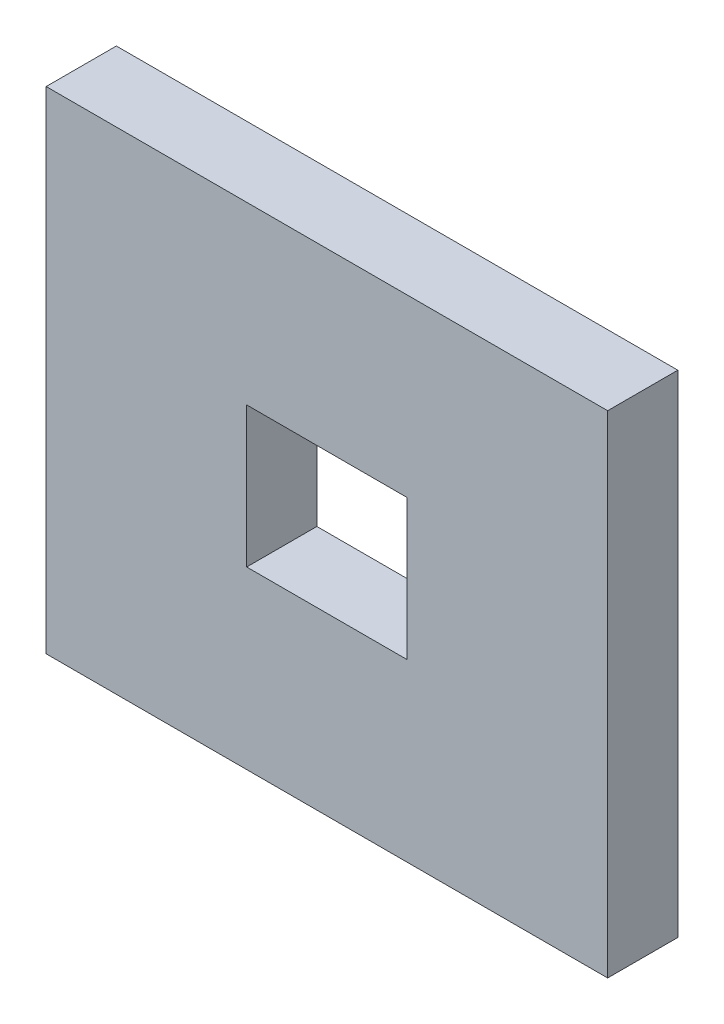
ISO-10303-21;
HEADER;
FILE_DESCRIPTION(('STEP AP214'),'2;1');
FILE_NAME('part.step','',(''),(''),'','','');
FILE_SCHEMA(('AUTOMOTIVE_DESIGN { 1 0 10303 214 1 1 1 1 }'));
ENDSEC;
DATA;
#1=APPLICATION_CONTEXT('core data for automotive mechanical design processes');
#2=APPLICATION_PROTOCOL_DEFINITION('international standard','automotive_design',2000,#1);
#3=PRODUCT_CONTEXT('',#1,'mechanical');
#4=PRODUCT('Part','Part','',(#3));
#5=PRODUCT_RELATED_PRODUCT_CATEGORY('part','',(#4));
#6=PRODUCT_DEFINITION_FORMATION('','',#4);
#7=PRODUCT_DEFINITION_CONTEXT('part definition',#1,'design');
#8=PRODUCT_DEFINITION('design','',#6,#7);
#9=PRODUCT_DEFINITION_SHAPE('','',#8);
#10=(LENGTH_UNIT() NAMED_UNIT(*) SI_UNIT(.MILLI.,.METRE.));
#11=(NAMED_UNIT(*) PLANE_ANGLE_UNIT() SI_UNIT($,.RADIAN.));
#12=(NAMED_UNIT(*) SI_UNIT($,.STERADIAN.) SOLID_ANGLE_UNIT());
#13=UNCERTAINTY_MEASURE_WITH_UNIT(LENGTH_MEASURE(1.E-05),#10,'distance_accuracy_value','');
#14=(GEOMETRIC_REPRESENTATION_CONTEXT(3) GLOBAL_UNCERTAINTY_ASSIGNED_CONTEXT((#13)) GLOBAL_UNIT_ASSIGNED_CONTEXT((#10,
#11,#12)) REPRESENTATION_CONTEXT('',''));
#15=CARTESIAN_POINT('',(0.,0.,0.));
#16=DIRECTION('',(0.,0.,1.));
#17=DIRECTION('',(1.,0.,0.));
#18=AXIS2_PLACEMENT_3D('',#15,#16,#17);
#19=CARTESIAN_POINT('',(0.,0.,10.));
#20=DIRECTION('',(0.,0.,-1.));
#21=DIRECTION('',(-1.,0.,0.));
#22=AXIS2_PLACEMENT_3D('',#19,#20,#21);
#23=PLANE('',#22);
#24=DIRECTION('',(0.,-1.,0.));
#25=VECTOR('',#24,1.);
#26=CARTESIAN_POINT('',(-40.,35.,10.));
#27=LINE('',#26,#25);
#28=CARTESIAN_POINT('',(-40.,35.,10.));
#29=VERTEX_POINT('',#28);
#30=CARTESIAN_POINT('',(-40.,-35.,10.));
#31=VERTEX_POINT('',#30);
#32=EDGE_CURVE('E135',#29,#31,#27,.T.);
#33=ORIENTED_EDGE('',*,*,#32,.T.);
#34=DIRECTION('',(1.,0.,0.));
#35=VECTOR('',#34,1.);
#36=CARTESIAN_POINT('',(40.,-35.,10.));
#37=LINE('',#36,#35);
#38=CARTESIAN_POINT('',(40.,-35.,10.));
#39=VERTEX_POINT('',#38);
#40=EDGE_CURVE('E138',#31,#39,#37,.T.);
#41=ORIENTED_EDGE('',*,*,#40,.T.);
#42=DIRECTION('',(0.,1.,0.));
#43=VECTOR('',#42,1.);
#44=CARTESIAN_POINT('',(40.,35.,10.));
#45=LINE('',#44,#43);
#46=CARTESIAN_POINT('',(40.,35.,10.));
#47=VERTEX_POINT('',#46);
#48=EDGE_CURVE('E141',#39,#47,#45,.T.);
#49=ORIENTED_EDGE('',*,*,#48,.T.);
#50=DIRECTION('',(-1.,0.,0.));
#51=VECTOR('',#50,1.);
#52=CARTESIAN_POINT('',(40.,35.,10.));
#53=LINE('',#52,#51);
#54=EDGE_CURVE('E143',#47,#29,#53,.T.);
#55=ORIENTED_EDGE('',*,*,#54,.T.);
#56=EDGE_LOOP('',(#33,#41,#49,#55));
#57=FACE_BOUND('',#56,.T.);
#58=DIRECTION('',(0.,-1.,0.));
#59=VECTOR('',#58,1.);
#60=CARTESIAN_POINT('',(-11.4285714285714,10.,10.));
#61=LINE('',#60,#59);
#62=CARTESIAN_POINT('',(-11.4285714285714,10.,10.));
#63=VERTEX_POINT('',#62);
#64=CARTESIAN_POINT('',(-11.4285714285714,-10.,10.));
#65=VERTEX_POINT('',#64);
#66=EDGE_CURVE('E99',#63,#65,#61,.T.);
#67=ORIENTED_EDGE('',*,*,#66,.F.);
#68=DIRECTION('',(-1.,0.,0.));
#69=VECTOR('',#68,1.);
#70=CARTESIAN_POINT('',(11.4285714285714,10.,10.));
#71=LINE('',#70,#69);
#72=CARTESIAN_POINT('',(11.4285714285714,10.,10.));
#73=VERTEX_POINT('',#72);
#74=EDGE_CURVE('E121',#73,#63,#71,.T.);
#75=ORIENTED_EDGE('',*,*,#74,.F.);
#76=DIRECTION('',(0.,1.,0.));
#77=VECTOR('',#76,1.);
#78=CARTESIAN_POINT('',(11.4285714285714,10.,10.));
#79=LINE('',#78,#77);
#80=CARTESIAN_POINT('',(11.4285714285714,-10.,10.));
#81=VERTEX_POINT('',#80);
#82=EDGE_CURVE('E119',#81,#73,#79,.T.);
#83=ORIENTED_EDGE('',*,*,#82,.F.);
#84=DIRECTION('',(1.,0.,0.));
#85=VECTOR('',#84,1.);
#86=CARTESIAN_POINT('',(11.4285714285714,-10.,10.));
#87=LINE('',#86,#85);
#88=EDGE_CURVE('E107',#65,#81,#87,.T.);
#89=ORIENTED_EDGE('',*,*,#88,.F.);
#90=EDGE_LOOP('',(#67,#75,#83,#89));
#91=FACE_BOUND('',#90,.T.);
#92=ADVANCED_FACE('F34',(#57,#91),#23,.F.);
#93=CARTESIAN_POINT('',(0.,0.,0.));
#94=DIRECTION('',(0.,0.,-1.));
#95=DIRECTION('',(-1.,0.,0.));
#96=AXIS2_PLACEMENT_3D('',#93,#94,#95);
#97=PLANE('',#96);
#98=DIRECTION('',(0.,-1.,0.));
#99=VECTOR('',#98,1.);
#100=CARTESIAN_POINT('',(-40.,35.,0.));
#101=LINE('',#100,#99);
#102=CARTESIAN_POINT('',(-40.,35.,0.));
#103=VERTEX_POINT('',#102);
#104=CARTESIAN_POINT('',(-40.,-35.,0.));
#105=VERTEX_POINT('',#104);
#106=EDGE_CURVE('E115',#103,#105,#101,.T.);
#107=ORIENTED_EDGE('',*,*,#106,.F.);
#108=DIRECTION('',(-1.,0.,0.));
#109=VECTOR('',#108,1.);
#110=CARTESIAN_POINT('',(40.,35.,0.));
#111=LINE('',#110,#109);
#112=CARTESIAN_POINT('',(40.,35.,0.));
#113=VERTEX_POINT('',#112);
#114=EDGE_CURVE('E139',#113,#103,#111,.T.);
#115=ORIENTED_EDGE('',*,*,#114,.F.);
#116=DIRECTION('',(0.,1.,0.));
#117=VECTOR('',#116,1.);
#118=CARTESIAN_POINT('',(40.,35.,0.));
#119=LINE('',#118,#117);
#120=CARTESIAN_POINT('',(40.,-35.,0.));
#121=VERTEX_POINT('',#120);
#122=EDGE_CURVE('E150',#121,#113,#119,.T.);
#123=ORIENTED_EDGE('',*,*,#122,.F.);
#124=DIRECTION('',(1.,0.,0.));
#125=VECTOR('',#124,1.);
#126=CARTESIAN_POINT('',(40.,-35.,0.));
#127=LINE('',#126,#125);
#128=EDGE_CURVE('E148',#105,#121,#127,.T.);
#129=ORIENTED_EDGE('',*,*,#128,.F.);
#130=EDGE_LOOP('',(#107,#115,#123,#129));
#131=FACE_BOUND('',#130,.T.);
#132=DIRECTION('',(-1.,0.,0.));
#133=VECTOR('',#132,1.);
#134=CARTESIAN_POINT('',(11.4285714285714,10.,0.));
#135=LINE('',#134,#133);
#136=CARTESIAN_POINT('',(11.4285714285714,10.,0.));
#137=VERTEX_POINT('',#136);
#138=CARTESIAN_POINT('',(-11.4285714285714,10.,0.));
#139=VERTEX_POINT('',#138);
#140=EDGE_CURVE('E108',#137,#139,#135,.T.);
#141=ORIENTED_EDGE('',*,*,#140,.T.);
#142=DIRECTION('',(0.,-1.,0.));
#143=VECTOR('',#142,1.);
#144=CARTESIAN_POINT('',(-11.4285714285714,10.,0.));
#145=LINE('',#144,#143);
#146=CARTESIAN_POINT('',(-11.4285714285714,-10.,0.));
#147=VERTEX_POINT('',#146);
#148=EDGE_CURVE('E57',#139,#147,#145,.T.);
#149=ORIENTED_EDGE('',*,*,#148,.T.);
#150=DIRECTION('',(1.,0.,0.));
#151=VECTOR('',#150,1.);
#152=CARTESIAN_POINT('',(11.4285714285714,-10.,0.));
#153=LINE('',#152,#151);
#154=CARTESIAN_POINT('',(11.4285714285714,-10.,0.));
#155=VERTEX_POINT('',#154);
#156=EDGE_CURVE('E114',#147,#155,#153,.T.);
#157=ORIENTED_EDGE('',*,*,#156,.T.);
#158=DIRECTION('',(0.,1.,0.));
#159=VECTOR('',#158,1.);
#160=CARTESIAN_POINT('',(11.4285714285714,10.,0.));
#161=LINE('',#160,#159);
#162=EDGE_CURVE('E127',#155,#137,#161,.T.);
#163=ORIENTED_EDGE('',*,*,#162,.T.);
#164=EDGE_LOOP('',(#141,#149,#157,#163));
#165=FACE_BOUND('',#164,.T.);
#166=ADVANCED_FACE('F168',(#131,#165),#97,.T.);
#167=CARTESIAN_POINT('',(-40.,35.,10.));
#168=DIRECTION('',(1.,0.,0.));
#169=DIRECTION('',(0.,1.,0.));
#170=AXIS2_PLACEMENT_3D('',#167,#168,#169);
#171=PLANE('',#170);
#172=ORIENTED_EDGE('',*,*,#106,.T.);
#173=DIRECTION('',(0.,0.,-1.));
#174=VECTOR('',#173,1.);
#175=CARTESIAN_POINT('',(-40.,-35.,10.));
#176=LINE('',#175,#174);
#177=EDGE_CURVE('E11',#31,#105,#176,.T.);
#178=ORIENTED_EDGE('',*,*,#177,.F.);
#179=ORIENTED_EDGE('',*,*,#32,.F.);
#180=DIRECTION('',(0.,0.,-1.));
#181=VECTOR('',#180,1.);
#182=CARTESIAN_POINT('',(-40.,35.,10.));
#183=LINE('',#182,#181);
#184=EDGE_CURVE('E145',#29,#103,#183,.T.);
#185=ORIENTED_EDGE('',*,*,#184,.T.);
#186=EDGE_LOOP('',(#172,#178,#179,#185));
#187=FACE_BOUND('',#186,.T.);
#188=ADVANCED_FACE('F36',(#187),#171,.F.);
#189=CARTESIAN_POINT('',(40.,-35.,10.));
#190=DIRECTION('',(0.,1.,0.));
#191=DIRECTION('',(-1.,0.,0.));
#192=AXIS2_PLACEMENT_3D('',#189,#190,#191);
#193=PLANE('',#192);
#194=ORIENTED_EDGE('',*,*,#128,.T.);
#195=DIRECTION('',(0.,0.,-1.));
#196=VECTOR('',#195,1.);
#197=CARTESIAN_POINT('',(40.,-35.,10.));
#198=LINE('',#197,#196);
#199=EDGE_CURVE('E42',#39,#121,#198,.T.);
#200=ORIENTED_EDGE('',*,*,#199,.F.);
#201=ORIENTED_EDGE('',*,*,#40,.F.);
#202=ORIENTED_EDGE('',*,*,#177,.T.);
#203=EDGE_LOOP('',(#194,#200,#201,#202));
#204=FACE_BOUND('',#203,.T.);
#205=ADVANCED_FACE('F178',(#204),#193,.F.);
#206=CARTESIAN_POINT('',(40.,35.,10.));
#207=DIRECTION('',(-1.,0.,0.));
#208=DIRECTION('',(0.,-1.,0.));
#209=AXIS2_PLACEMENT_3D('',#206,#207,#208);
#210=PLANE('',#209);
#211=ORIENTED_EDGE('',*,*,#122,.T.);
#212=DIRECTION('',(0.,0.,-1.));
#213=VECTOR('',#212,1.);
#214=CARTESIAN_POINT('',(40.,35.,10.));
#215=LINE('',#214,#213);
#216=EDGE_CURVE('E155',#47,#113,#215,.T.);
#217=ORIENTED_EDGE('',*,*,#216,.F.);
#218=ORIENTED_EDGE('',*,*,#48,.F.);
#219=ORIENTED_EDGE('',*,*,#199,.T.);
#220=EDGE_LOOP('',(#211,#217,#218,#219));
#221=FACE_BOUND('',#220,.T.);
#222=ADVANCED_FACE('F162',(#221),#210,.F.);
#223=CARTESIAN_POINT('',(40.,35.,10.));
#224=DIRECTION('',(0.,-1.,0.));
#225=DIRECTION('',(1.,0.,0.));
#226=AXIS2_PLACEMENT_3D('',#223,#224,#225);
#227=PLANE('',#226);
#228=ORIENTED_EDGE('',*,*,#114,.T.);
#229=ORIENTED_EDGE('',*,*,#184,.F.);
#230=ORIENTED_EDGE('',*,*,#54,.F.);
#231=ORIENTED_EDGE('',*,*,#216,.T.);
#232=EDGE_LOOP('',(#228,#229,#230,#231));
#233=FACE_BOUND('',#232,.T.);
#234=ADVANCED_FACE('F172',(#233),#227,.F.);
#235=CARTESIAN_POINT('',(-11.4285714285714,10.,10.));
#236=DIRECTION('',(1.,0.,0.));
#237=DIRECTION('',(0.,0.,-1.));
#238=AXIS2_PLACEMENT_3D('',#235,#236,#237);
#239=PLANE('',#238);
#240=ORIENTED_EDGE('',*,*,#148,.F.);
#241=DIRECTION('',(0.,0.,-1.));
#242=VECTOR('',#241,1.);
#243=CARTESIAN_POINT('',(-11.4285714285714,10.,10.));
#244=LINE('',#243,#242);
#245=EDGE_CURVE('E103',#63,#139,#244,.T.);
#246=ORIENTED_EDGE('',*,*,#245,.F.);
#247=ORIENTED_EDGE('',*,*,#66,.T.);
#248=DIRECTION('',(0.,0.,-1.));
#249=VECTOR('',#248,1.);
#250=CARTESIAN_POINT('',(-11.4285714285714,-10.,10.));
#251=LINE('',#250,#249);
#252=EDGE_CURVE('E102',#65,#147,#251,.T.);
#253=ORIENTED_EDGE('',*,*,#252,.T.);
#254=EDGE_LOOP('',(#240,#246,#247,#253));
#255=FACE_BOUND('',#254,.T.);
#256=ADVANCED_FACE('F101',(#255),#239,.T.);
#257=CARTESIAN_POINT('',(11.4285714285714,-10.,10.));
#258=DIRECTION('',(0.,1.,0.));
#259=DIRECTION('',(0.,0.,1.));
#260=AXIS2_PLACEMENT_3D('',#257,#258,#259);
#261=PLANE('',#260);
#262=ORIENTED_EDGE('',*,*,#156,.F.);
#263=ORIENTED_EDGE('',*,*,#252,.F.);
#264=ORIENTED_EDGE('',*,*,#88,.T.);
#265=DIRECTION('',(0.,0.,-1.));
#266=VECTOR('',#265,1.);
#267=CARTESIAN_POINT('',(11.4285714285714,-10.,10.));
#268=LINE('',#267,#266);
#269=EDGE_CURVE('E116',#81,#155,#268,.T.);
#270=ORIENTED_EDGE('',*,*,#269,.T.);
#271=EDGE_LOOP('',(#262,#263,#264,#270));
#272=FACE_BOUND('',#271,.T.);
#273=ADVANCED_FACE('F111',(#272),#261,.T.);
#274=CARTESIAN_POINT('',(11.4285714285714,10.,10.));
#275=DIRECTION('',(-1.,0.,0.));
#276=DIRECTION('',(0.,0.,1.));
#277=AXIS2_PLACEMENT_3D('',#274,#275,#276);
#278=PLANE('',#277);
#279=ORIENTED_EDGE('',*,*,#162,.F.);
#280=ORIENTED_EDGE('',*,*,#269,.F.);
#281=ORIENTED_EDGE('',*,*,#82,.T.);
#282=DIRECTION('',(0.,0.,-1.));
#283=VECTOR('',#282,1.);
#284=CARTESIAN_POINT('',(11.4285714285714,10.,10.));
#285=LINE('',#284,#283);
#286=EDGE_CURVE('E49',#73,#137,#285,.T.);
#287=ORIENTED_EDGE('',*,*,#286,.T.);
#288=EDGE_LOOP('',(#279,#280,#281,#287));
#289=FACE_BOUND('',#288,.T.);
#290=ADVANCED_FACE('F201',(#289),#278,.T.);
#291=CARTESIAN_POINT('',(11.4285714285714,10.,10.));
#292=DIRECTION('',(0.,-1.,0.));
#293=DIRECTION('',(0.,0.,-1.));
#294=AXIS2_PLACEMENT_3D('',#291,#292,#293);
#295=PLANE('',#294);
#296=ORIENTED_EDGE('',*,*,#140,.F.);
#297=ORIENTED_EDGE('',*,*,#286,.F.);
#298=ORIENTED_EDGE('',*,*,#74,.T.);
#299=ORIENTED_EDGE('',*,*,#245,.T.);
#300=EDGE_LOOP('',(#296,#297,#298,#299));
#301=FACE_BOUND('',#300,.T.);
#302=ADVANCED_FACE('F205',(#301),#295,.T.);
#303=CLOSED_SHELL('',(#92,#166,#188,#205,#222,#234,#256,#273,#290,#302));
#304=MANIFOLD_SOLID_BREP('B2',#303);
#305=ADVANCED_BREP_SHAPE_REPRESENTATION('',(#18,#304),#14);
#306=SHAPE_DEFINITION_REPRESENTATION(#9,#305);
ENDSEC;
END-ISO-10303-21;
